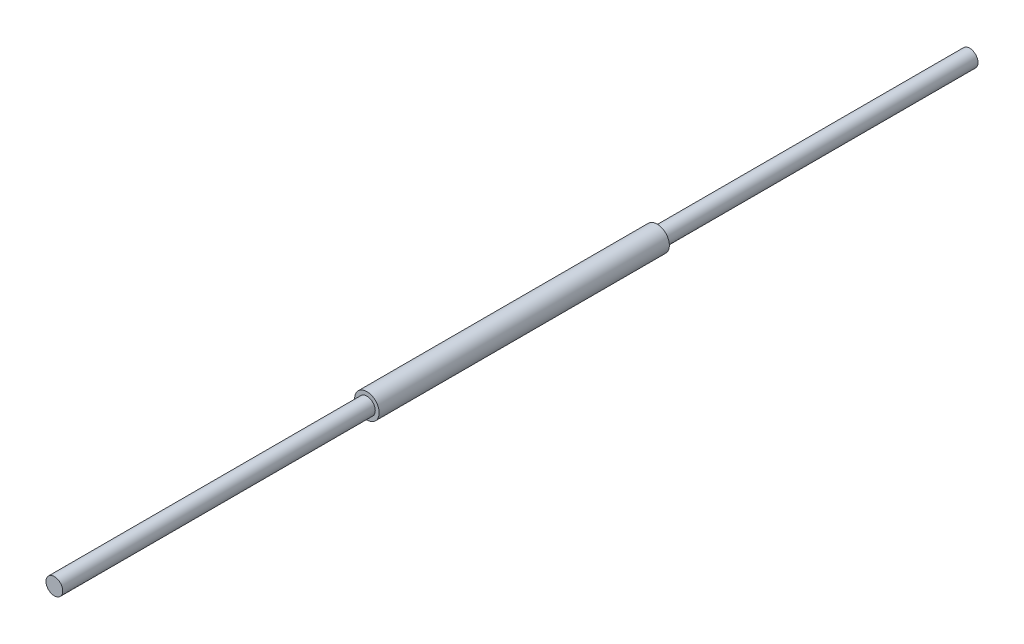
ISO-10303-21;
HEADER;
FILE_DESCRIPTION(('STEP AP214'),'2;1');
FILE_NAME('part.step','',(''),(''),'','','');
FILE_SCHEMA(('AUTOMOTIVE_DESIGN { 1 0 10303 214 1 1 1 1 }'));
ENDSEC;
DATA;
#1=APPLICATION_CONTEXT('core data for automotive mechanical design processes');
#2=APPLICATION_PROTOCOL_DEFINITION('international standard','automotive_design',2000,#1);
#3=PRODUCT_CONTEXT('',#1,'mechanical');
#4=PRODUCT('Part','Part','',(#3));
#5=PRODUCT_RELATED_PRODUCT_CATEGORY('part','',(#4));
#6=PRODUCT_DEFINITION_FORMATION('','',#4);
#7=PRODUCT_DEFINITION_CONTEXT('part definition',#1,'design');
#8=PRODUCT_DEFINITION('design','',#6,#7);
#9=PRODUCT_DEFINITION_SHAPE('','',#8);
#10=(LENGTH_UNIT() NAMED_UNIT(*) SI_UNIT(.MILLI.,.METRE.));
#11=(NAMED_UNIT(*) PLANE_ANGLE_UNIT() SI_UNIT($,.RADIAN.));
#12=(NAMED_UNIT(*) SI_UNIT($,.STERADIAN.) SOLID_ANGLE_UNIT());
#13=UNCERTAINTY_MEASURE_WITH_UNIT(LENGTH_MEASURE(1.E-05),#10,'distance_accuracy_value','');
#14=(GEOMETRIC_REPRESENTATION_CONTEXT(3) GLOBAL_UNCERTAINTY_ASSIGNED_CONTEXT((#13)) GLOBAL_UNIT_ASSIGNED_CONTEXT((#10,
#11,#12)) REPRESENTATION_CONTEXT('',''));
#15=CARTESIAN_POINT('',(0.,0.,0.));
#16=DIRECTION('',(0.,0.,1.));
#17=DIRECTION('',(1.,0.,0.));
#18=AXIS2_PLACEMENT_3D('',#15,#16,#17);
#19=CARTESIAN_POINT('',(0.,0.,260.35));
#20=DIRECTION('',(0.,0.,-1.));
#21=DIRECTION('',(-1.,0.,0.));
#22=AXIS2_PLACEMENT_3D('',#19,#20,#21);
#23=CYLINDRICAL_SURFACE('',#22,4.7625);
#24=CARTESIAN_POINT('',(0.,0.,82.55));
#25=DIRECTION('',(0.,0.,1.));
#26=DIRECTION('',(1.,0.,0.));
#27=AXIS2_PLACEMENT_3D('',#24,#25,#26);
#28=CIRCLE('',#27,4.7625);
#29=CARTESIAN_POINT('',(4.7625,0.,82.55));
#30=VERTEX_POINT('',#29);
#31=EDGE_CURVE('E69',#30,#30,#28,.T.);
#32=ORIENTED_EDGE('',*,*,#31,.T.);
#33=EDGE_LOOP('',(#32));
#34=FACE_BOUND('',#33,.T.);
#35=CARTESIAN_POINT('',(0.,0.,260.35));
#36=DIRECTION('',(0.,0.,1.));
#37=DIRECTION('',(1.,0.,0.));
#38=AXIS2_PLACEMENT_3D('',#35,#36,#37);
#39=CIRCLE('',#38,4.7625);
#40=CARTESIAN_POINT('',(4.7625,0.,260.35));
#41=VERTEX_POINT('',#40);
#42=EDGE_CURVE('E52',#41,#41,#39,.T.);
#43=ORIENTED_EDGE('',*,*,#42,.F.);
#44=EDGE_LOOP('',(#43));
#45=FACE_BOUND('',#44,.T.);
#46=ADVANCED_FACE('F45',(#34,#45),#23,.T.);
#47=CARTESIAN_POINT('',(0.,0.,260.35));
#48=DIRECTION('',(0.,0.,1.));
#49=DIRECTION('',(1.,0.,0.));
#50=AXIS2_PLACEMENT_3D('',#47,#48,#49);
#51=PLANE('',#50);
#52=ORIENTED_EDGE('',*,*,#42,.T.);
#53=EDGE_LOOP('',(#52));
#54=FACE_BOUND('',#53,.T.);
#55=ADVANCED_FACE('F82',(#54),#51,.T.);
#56=CARTESIAN_POINT('',(0.,0.,82.55));
#57=DIRECTION('',(0.,0.,1.));
#58=DIRECTION('',(1.,0.,0.));
#59=AXIS2_PLACEMENT_3D('',#56,#57,#58);
#60=PLANE('',#59);
#61=CARTESIAN_POINT('',(0.,0.,82.55));
#62=DIRECTION('',(0.,0.,1.));
#63=DIRECTION('',(1.,0.,0.));
#64=AXIS2_PLACEMENT_3D('',#61,#62,#63);
#65=CIRCLE('',#64,6.985);
#66=CARTESIAN_POINT('',(6.985,0.,82.55));
#67=VERTEX_POINT('',#66);
#68=EDGE_CURVE('E63',#67,#67,#65,.T.);
#69=ORIENTED_EDGE('',*,*,#68,.T.);
#70=EDGE_LOOP('',(#69));
#71=FACE_BOUND('',#70,.T.);
#72=ORIENTED_EDGE('',*,*,#31,.F.);
#73=EDGE_LOOP('',(#72));
#74=FACE_BOUND('',#73,.T.);
#75=ADVANCED_FACE('F79',(#71,#74),#60,.T.);
#76=CARTESIAN_POINT('',(0.,0.,-82.55));
#77=DIRECTION('',(0.,0.,1.));
#78=DIRECTION('',(1.,0.,0.));
#79=AXIS2_PLACEMENT_3D('',#76,#77,#78);
#80=PLANE('',#79);
#81=CARTESIAN_POINT('',(0.,0.,-82.55));
#82=DIRECTION('',(0.,0.,1.));
#83=DIRECTION('',(1.,0.,0.));
#84=AXIS2_PLACEMENT_3D('',#81,#82,#83);
#85=CIRCLE('',#84,6.985);
#86=CARTESIAN_POINT('',(6.985,0.,-82.55));
#87=VERTEX_POINT('',#86);
#88=EDGE_CURVE('E65',#87,#87,#85,.T.);
#89=ORIENTED_EDGE('',*,*,#88,.F.);
#90=EDGE_LOOP('',(#89));
#91=FACE_BOUND('',#90,.T.);
#92=CARTESIAN_POINT('',(0.,0.,-82.55));
#93=DIRECTION('',(0.,0.,1.));
#94=DIRECTION('',(1.,0.,0.));
#95=AXIS2_PLACEMENT_3D('',#92,#93,#94);
#96=CIRCLE('',#95,4.7625);
#97=CARTESIAN_POINT('',(4.7625,0.,-82.55));
#98=VERTEX_POINT('',#97);
#99=EDGE_CURVE('E10',#98,#98,#96,.T.);
#100=ORIENTED_EDGE('',*,*,#99,.T.);
#101=EDGE_LOOP('',(#100));
#102=FACE_BOUND('',#101,.T.);
#103=ADVANCED_FACE('F81',(#91,#102),#80,.F.);
#104=CARTESIAN_POINT('',(0.,0.,82.55));
#105=DIRECTION('',(0.,0.,-1.));
#106=DIRECTION('',(-1.,0.,0.));
#107=AXIS2_PLACEMENT_3D('',#104,#105,#106);
#108=CYLINDRICAL_SURFACE('',#107,6.985);
#109=ORIENTED_EDGE('',*,*,#68,.F.);
#110=EDGE_LOOP('',(#109));
#111=FACE_BOUND('',#110,.T.);
#112=ORIENTED_EDGE('',*,*,#88,.T.);
#113=EDGE_LOOP('',(#112));
#114=FACE_BOUND('',#113,.T.);
#115=ADVANCED_FACE('F89',(#111,#114),#108,.T.);
#116=CARTESIAN_POINT('',(0.,0.,-260.35));
#117=DIRECTION('',(0.,0.,1.));
#118=DIRECTION('',(1.,0.,0.));
#119=AXIS2_PLACEMENT_3D('',#116,#117,#118);
#120=PLANE('',#119);
#121=CARTESIAN_POINT('',(0.,0.,-260.35));
#122=DIRECTION('',(0.,0.,1.));
#123=DIRECTION('',(1.,0.,0.));
#124=AXIS2_PLACEMENT_3D('',#121,#122,#123);
#125=CIRCLE('',#124,4.7625);
#126=CARTESIAN_POINT('',(4.7625,0.,-260.35));
#127=VERTEX_POINT('',#126);
#128=EDGE_CURVE('E57',#127,#127,#125,.T.);
#129=ORIENTED_EDGE('',*,*,#128,.F.);
#130=EDGE_LOOP('',(#129));
#131=FACE_BOUND('',#130,.T.);
#132=ADVANCED_FACE('F99',(#131),#120,.F.);
#133=ORIENTED_EDGE('',*,*,#128,.T.);
#134=EDGE_LOOP('',(#133));
#135=FACE_BOUND('',#134,.T.);
#136=ORIENTED_EDGE('',*,*,#99,.F.);
#137=EDGE_LOOP('',(#136));
#138=FACE_BOUND('',#137,.T.);
#139=ADVANCED_FACE('F94',(#135,#138),#23,.T.);
#140=CLOSED_SHELL('',(#46,#55,#75,#103,#115,#132,#139));
#141=MANIFOLD_SOLID_BREP('B2',#140);
#142=ADVANCED_BREP_SHAPE_REPRESENTATION('',(#18,#141),#14);
#143=SHAPE_DEFINITION_REPRESENTATION(#9,#142);
ENDSEC;
END-ISO-10303-21;
